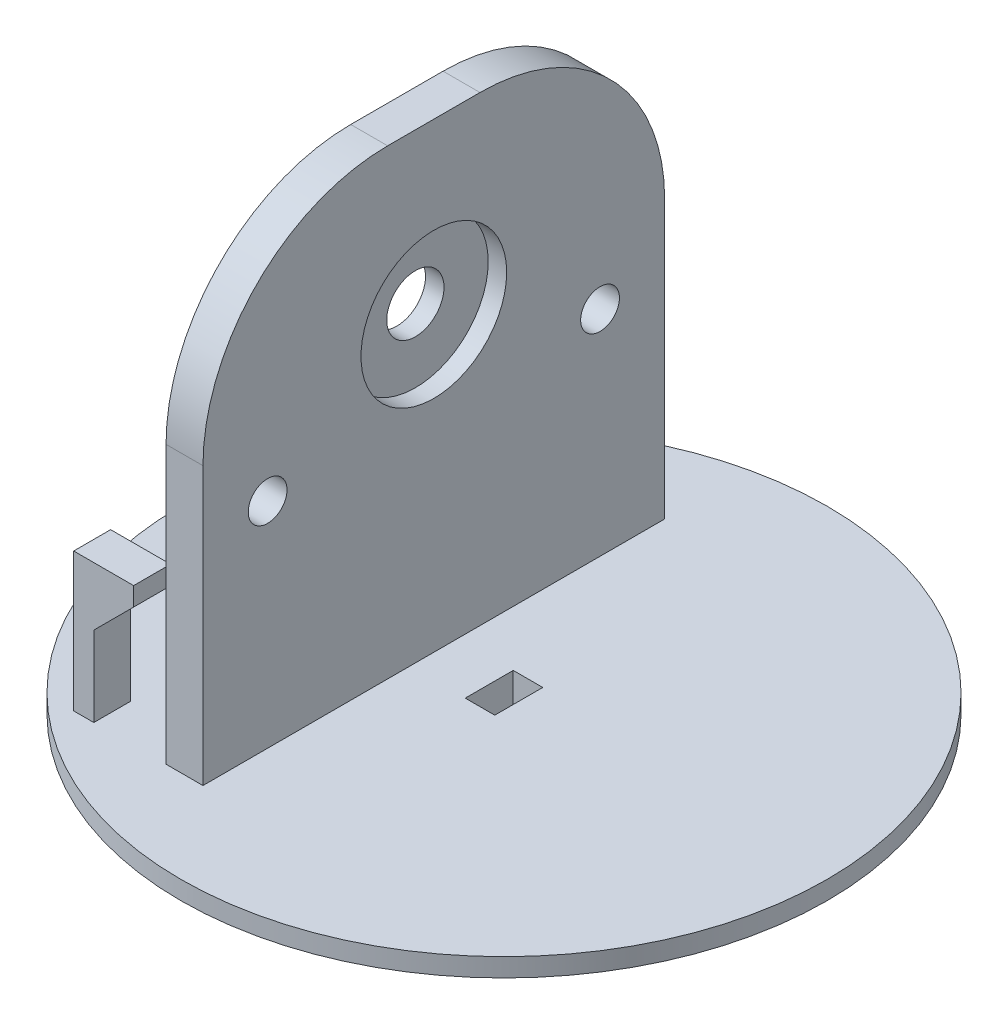
ISO-10303-21;
HEADER;
FILE_DESCRIPTION(('STEP AP214'),'2;1');
FILE_NAME('part.step','',(''),(''),'','','');
FILE_SCHEMA(('AUTOMOTIVE_DESIGN { 1 0 10303 214 1 1 1 1 }'));
ENDSEC;
DATA;
#1=APPLICATION_CONTEXT('core data for automotive mechanical design processes');
#2=APPLICATION_PROTOCOL_DEFINITION('international standard','automotive_design',2000,#1);
#3=PRODUCT_CONTEXT('',#1,'mechanical');
#4=PRODUCT('Part','Part','',(#3));
#5=PRODUCT_RELATED_PRODUCT_CATEGORY('part','',(#4));
#6=PRODUCT_DEFINITION_FORMATION('','',#4);
#7=PRODUCT_DEFINITION_CONTEXT('part definition',#1,'design');
#8=PRODUCT_DEFINITION('design','',#6,#7);
#9=PRODUCT_DEFINITION_SHAPE('','',#8);
#10=(LENGTH_UNIT() NAMED_UNIT(*) SI_UNIT(.MILLI.,.METRE.));
#11=(NAMED_UNIT(*) PLANE_ANGLE_UNIT() SI_UNIT($,.RADIAN.));
#12=(NAMED_UNIT(*) SI_UNIT($,.STERADIAN.) SOLID_ANGLE_UNIT());
#13=UNCERTAINTY_MEASURE_WITH_UNIT(LENGTH_MEASURE(1.E-05),#10,'distance_accuracy_value','');
#14=(GEOMETRIC_REPRESENTATION_CONTEXT(3) GLOBAL_UNCERTAINTY_ASSIGNED_CONTEXT((#13)) GLOBAL_UNIT_ASSIGNED_CONTEXT((#10,
#11,#12)) REPRESENTATION_CONTEXT('',''));
#15=CARTESIAN_POINT('',(0.,0.,0.));
#16=DIRECTION('',(0.,0.,1.));
#17=DIRECTION('',(1.,0.,0.));
#18=AXIS2_PLACEMENT_3D('',#15,#16,#17);
#19=CARTESIAN_POINT('',(-57.6,33.6912734460262,0.));
#20=DIRECTION('',(1.,0.,0.));
#21=DIRECTION('',(0.,0.,-1.));
#22=AXIS2_PLACEMENT_3D('',#19,#20,#21);
#23=CYLINDRICAL_SURFACE('',#22,3.1);
#24=CARTESIAN_POINT('',(-11.6,33.6912734460262,0.));
#25=DIRECTION('',(1.,0.,0.));
#26=DIRECTION('',(0.,0.,-1.));
#27=AXIS2_PLACEMENT_3D('',#24,#25,#26);
#28=CIRCLE('',#27,3.1);
#29=CARTESIAN_POINT('',(-11.6,33.6912734460262,-3.1));
#30=VERTEX_POINT('',#29);
#31=EDGE_CURVE('E173',#30,#30,#28,.T.);
#32=ORIENTED_EDGE('',*,*,#31,.F.);
#33=EDGE_LOOP('',(#32));
#34=FACE_BOUND('',#33,.T.);
#35=CARTESIAN_POINT('',(-9.6,33.6912734460262,0.));
#36=DIRECTION('',(1.,0.,0.));
#37=DIRECTION('',(0.,0.,-1.));
#38=AXIS2_PLACEMENT_3D('',#35,#36,#37);
#39=CIRCLE('',#38,3.1);
#40=CARTESIAN_POINT('',(-9.6,33.6912734460262,-3.1));
#41=VERTEX_POINT('',#40);
#42=EDGE_CURVE('E49',#41,#41,#39,.F.);
#43=ORIENTED_EDGE('',*,*,#42,.F.);
#44=EDGE_LOOP('',(#43));
#45=FACE_BOUND('',#44,.T.);
#46=ADVANCED_FACE('F45',(#34,#45),#23,.F.);
#47=CARTESIAN_POINT('',(-7.59999999999999,52.,25.));
#48=DIRECTION('',(0.,0.,-1.));
#49=DIRECTION('',(-1.,0.,0.));
#50=AXIS2_PLACEMENT_3D('',#47,#48,#49);
#51=PLANE('',#50);
#52=DIRECTION('',(1.,0.,0.));
#53=VECTOR('',#52,1.);
#54=CARTESIAN_POINT('',(-7.59999999999999,2.,25.));
#55=LINE('',#54,#53);
#56=CARTESIAN_POINT('',(-21.6,2.,25.));
#57=VERTEX_POINT('',#56);
#58=CARTESIAN_POINT('',(-19.421422774152,2.,25.));
#59=VERTEX_POINT('',#58);
#60=EDGE_CURVE('E187',#57,#59,#55,.T.);
#61=ORIENTED_EDGE('',*,*,#60,.T.);
#62=DIRECTION('',(0.,-1.,0.));
#63=VECTOR('',#62,1.);
#64=CARTESIAN_POINT('',(-19.421422774152,10.669570710931,25.));
#65=LINE('',#64,#63);
#66=CARTESIAN_POINT('',(-19.421422774152,10.669570710931,25.));
#67=VERTEX_POINT('',#66);
#68=EDGE_CURVE('E273',#67,#59,#65,.T.);
#69=ORIENTED_EDGE('',*,*,#68,.F.);
#70=DIRECTION('',(-0.707106781186548,-0.707106781186547,0.));
#71=VECTOR('',#70,1.);
#72=CARTESIAN_POINT('',(-15.1104647248126,14.9805287602704,25.));
#73=LINE('',#72,#71);
#74=CARTESIAN_POINT('',(-15.1104647248126,14.9805287602704,25.));
#75=VERTEX_POINT('',#74);
#76=EDGE_CURVE('E278',#75,#67,#73,.T.);
#77=ORIENTED_EDGE('',*,*,#76,.F.);
#78=DIRECTION('',(0.,-1.,0.));
#79=VECTOR('',#78,1.);
#80=CARTESIAN_POINT('',(-15.1104647248126,17.,25.));
#81=LINE('',#80,#79);
#82=CARTESIAN_POINT('',(-15.1104647248126,17.,25.));
#83=VERTEX_POINT('',#82);
#84=EDGE_CURVE('E271',#83,#75,#81,.T.);
#85=ORIENTED_EDGE('',*,*,#84,.F.);
#86=DIRECTION('',(1.,0.,0.));
#87=VECTOR('',#86,1.);
#88=CARTESIAN_POINT('',(-11.6,17.,25.));
#89=LINE('',#88,#87);
#90=CARTESIAN_POINT('',(-21.6,17.,25.));
#91=VERTEX_POINT('',#90);
#92=EDGE_CURVE('E289',#91,#83,#89,.T.);
#93=ORIENTED_EDGE('',*,*,#92,.F.);
#94=DIRECTION('',(0.,-1.,0.));
#95=VECTOR('',#94,1.);
#96=CARTESIAN_POINT('',(-21.6,17.,25.));
#97=LINE('',#96,#95);
#98=EDGE_CURVE('E292',#91,#57,#97,.T.);
#99=ORIENTED_EDGE('',*,*,#98,.T.);
#100=EDGE_LOOP('',(#61,#69,#77,#85,#93,#99));
#101=FACE_BOUND('',#100,.T.);
#102=ADVANCED_FACE('F338',(#101),#51,.F.);
#103=CARTESIAN_POINT('',(0.,2.,0.));
#104=DIRECTION('',(0.,1.,0.));
#105=DIRECTION('',(0.,0.,1.));
#106=AXIS2_PLACEMENT_3D('',#103,#104,#105);
#107=PLANE('',#106);
#108=DIRECTION('',(-1.,0.,0.));
#109=VECTOR('',#108,1.);
#110=CARTESIAN_POINT('',(-11.6,2.,21.));
#111=LINE('',#110,#109);
#112=CARTESIAN_POINT('',(-19.421422774152,2.,21.));
#113=VERTEX_POINT('',#112);
#114=CARTESIAN_POINT('',(-21.6,2.,21.));
#115=VERTEX_POINT('',#114);
#116=EDGE_CURVE('E283',#113,#115,#111,.T.);
#117=ORIENTED_EDGE('',*,*,#116,.F.);
#118=DIRECTION('',(0.,0.,1.));
#119=VECTOR('',#118,1.);
#120=CARTESIAN_POINT('',(-19.421422774152,2.,10.));
#121=LINE('',#120,#119);
#122=EDGE_CURVE('E275',#113,#59,#121,.T.);
#123=ORIENTED_EDGE('',*,*,#122,.T.);
#124=ORIENTED_EDGE('',*,*,#60,.F.);
#125=DIRECTION('',(0.,0.,1.));
#126=VECTOR('',#125,1.);
#127=CARTESIAN_POINT('',(-21.6,2.,25.));
#128=LINE('',#127,#126);
#129=EDGE_CURVE('E287',#115,#57,#128,.T.);
#130=ORIENTED_EDGE('',*,*,#129,.F.);
#131=EDGE_LOOP('',(#117,#123,#124,#130));
#132=FACE_BOUND('',#131,.T.);
#133=CARTESIAN_POINT('',(-11.6,2.,25.));
#134=VERTEX_POINT('',#133);
#135=CARTESIAN_POINT('',(-7.59999999999999,2.,25.));
#136=VERTEX_POINT('',#135);
#137=EDGE_CURVE('E172',#134,#136,#55,.T.);
#138=ORIENTED_EDGE('',*,*,#137,.F.);
#139=DIRECTION('',(0.,0.,1.));
#140=VECTOR('',#139,1.);
#141=CARTESIAN_POINT('',(-11.6,2.,-25.));
#142=LINE('',#141,#140);
#143=CARTESIAN_POINT('',(-11.6,2.,-25.));
#144=VERTEX_POINT('',#143);
#145=EDGE_CURVE('E161',#144,#134,#142,.T.);
#146=ORIENTED_EDGE('',*,*,#145,.F.);
#147=DIRECTION('',(-1.,0.,0.));
#148=VECTOR('',#147,1.);
#149=CARTESIAN_POINT('',(-7.6,2.,-25.));
#150=LINE('',#149,#148);
#151=CARTESIAN_POINT('',(-7.6,2.,-25.));
#152=VERTEX_POINT('',#151);
#153=EDGE_CURVE('E193',#152,#144,#150,.T.);
#154=ORIENTED_EDGE('',*,*,#153,.F.);
#155=DIRECTION('',(0.,0.,-1.));
#156=VECTOR('',#155,1.);
#157=CARTESIAN_POINT('',(-7.6,2.,-25.));
#158=LINE('',#157,#156);
#159=EDGE_CURVE('E186',#136,#152,#158,.T.);
#160=ORIENTED_EDGE('',*,*,#159,.F.);
#161=EDGE_LOOP('',(#138,#146,#154,#160));
#162=FACE_BOUND('',#161,.T.);
#163=CARTESIAN_POINT('',(0.,2.,0.));
#164=DIRECTION('',(0.,1.,0.));
#165=DIRECTION('',(0.,0.,1.));
#166=AXIS2_PLACEMENT_3D('',#163,#164,#165);
#167=CIRCLE('',#166,35.);
#168=CARTESIAN_POINT('',(0.,2.,35.));
#169=VERTEX_POINT('',#168);
#170=EDGE_CURVE('E230',#169,#169,#167,.T.);
#171=ORIENTED_EDGE('',*,*,#170,.T.);
#172=EDGE_LOOP('',(#171));
#173=FACE_BOUND('',#172,.T.);
#174=DIRECTION('',(-1.,0.,0.));
#175=VECTOR('',#174,1.);
#176=CARTESIAN_POINT('',(-1.6,2.,-2.6));
#177=LINE('',#176,#175);
#178=CARTESIAN_POINT('',(1.6,2.,-2.6));
#179=VERTEX_POINT('',#178);
#180=CARTESIAN_POINT('',(-1.6,2.,-2.6));
#181=VERTEX_POINT('',#180);
#182=EDGE_CURVE('E214',#179,#181,#177,.T.);
#183=ORIENTED_EDGE('',*,*,#182,.F.);
#184=DIRECTION('',(0.,0.,-1.));
#185=VECTOR('',#184,1.);
#186=CARTESIAN_POINT('',(1.6,2.,2.6));
#187=LINE('',#186,#185);
#188=CARTESIAN_POINT('',(1.6,2.,2.6));
#189=VERTEX_POINT('',#188);
#190=EDGE_CURVE('E212',#189,#179,#187,.T.);
#191=ORIENTED_EDGE('',*,*,#190,.F.);
#192=DIRECTION('',(1.,0.,0.));
#193=VECTOR('',#192,1.);
#194=CARTESIAN_POINT('',(-1.6,2.,2.6));
#195=LINE('',#194,#193);
#196=CARTESIAN_POINT('',(-1.6,2.,2.6));
#197=VERTEX_POINT('',#196);
#198=EDGE_CURVE('E219',#197,#189,#195,.T.);
#199=ORIENTED_EDGE('',*,*,#198,.F.);
#200=DIRECTION('',(0.,0.,1.));
#201=VECTOR('',#200,1.);
#202=CARTESIAN_POINT('',(-1.6,2.,2.6));
#203=LINE('',#202,#201);
#204=EDGE_CURVE('E216',#181,#197,#203,.T.);
#205=ORIENTED_EDGE('',*,*,#204,.F.);
#206=EDGE_LOOP('',(#183,#191,#199,#205));
#207=FACE_BOUND('',#206,.T.);
#208=ADVANCED_FACE('F183',(#132,#162,#173,#207),#107,.T.);
#209=CARTESIAN_POINT('',(-11.6,52.,-25.));
#210=DIRECTION('',(1.,0.,0.));
#211=DIRECTION('',(0.,0.,-1.));
#212=AXIS2_PLACEMENT_3D('',#209,#210,#211);
#213=PLANE('',#212);
#214=ORIENTED_EDGE('',*,*,#145,.T.);
#215=DIRECTION('',(0.,-1.,0.));
#216=VECTOR('',#215,1.);
#217=CARTESIAN_POINT('',(-11.6,52.,25.));
#218=LINE('',#217,#216);
#219=CARTESIAN_POINT('',(-11.6,32.,25.));
#220=VERTEX_POINT('',#219);
#221=EDGE_CURVE('E165',#220,#134,#218,.T.);
#222=ORIENTED_EDGE('',*,*,#221,.F.);
#223=CARTESIAN_POINT('',(-11.6,32.,5.));
#224=DIRECTION('',(1.,0.,0.));
#225=DIRECTION('',(0.,0.,-1.));
#226=AXIS2_PLACEMENT_3D('',#223,#224,#225);
#227=CIRCLE('',#226,20.);
#228=CARTESIAN_POINT('',(-11.6,52.,5.));
#229=VERTEX_POINT('',#228);
#230=EDGE_CURVE('E241',#220,#229,#227,.F.);
#231=ORIENTED_EDGE('',*,*,#230,.T.);
#232=DIRECTION('',(0.,0.,1.));
#233=VECTOR('',#232,1.);
#234=CARTESIAN_POINT('',(-11.6,52.,-25.));
#235=LINE('',#234,#233);
#236=CARTESIAN_POINT('',(-11.6,52.,-5.));
#237=VERTEX_POINT('',#236);
#238=EDGE_CURVE('E195',#237,#229,#235,.T.);
#239=ORIENTED_EDGE('',*,*,#238,.F.);
#240=CARTESIAN_POINT('',(-11.6,32.,-5.));
#241=DIRECTION('',(1.,0.,0.));
#242=DIRECTION('',(0.,0.,-1.));
#243=AXIS2_PLACEMENT_3D('',#240,#241,#242);
#244=CIRCLE('',#243,20.);
#245=CARTESIAN_POINT('',(-11.6,32.,-25.));
#246=VERTEX_POINT('',#245);
#247=EDGE_CURVE('E243',#237,#246,#244,.F.);
#248=ORIENTED_EDGE('',*,*,#247,.T.);
#249=DIRECTION('',(0.,-1.,0.));
#250=VECTOR('',#249,1.);
#251=CARTESIAN_POINT('',(-11.6,52.,-25.));
#252=LINE('',#251,#250);
#253=EDGE_CURVE('E167',#246,#144,#252,.T.);
#254=ORIENTED_EDGE('',*,*,#253,.T.);
#255=EDGE_LOOP('',(#214,#222,#231,#239,#248,#254));
#256=FACE_BOUND('',#255,.T.);
#257=ORIENTED_EDGE('',*,*,#31,.T.);
#258=EDGE_LOOP('',(#257));
#259=FACE_BOUND('',#258,.T.);
#260=CARTESIAN_POINT('',(-11.6,25.1912734460262,-18.));
#261=DIRECTION('',(1.,0.,0.));
#262=DIRECTION('',(0.,0.,-1.));
#263=AXIS2_PLACEMENT_3D('',#260,#261,#262);
#264=CIRCLE('',#263,2.1);
#265=CARTESIAN_POINT('',(-11.6,25.1912734460262,-20.1));
#266=VERTEX_POINT('',#265);
#267=EDGE_CURVE('E305',#266,#266,#264,.T.);
#268=ORIENTED_EDGE('',*,*,#267,.T.);
#269=EDGE_LOOP('',(#268));
#270=FACE_BOUND('',#269,.T.);
#271=CARTESIAN_POINT('',(-11.6,25.1912734460262,18.));
#272=DIRECTION('',(1.,0.,0.));
#273=DIRECTION('',(0.,0.,-1.));
#274=AXIS2_PLACEMENT_3D('',#271,#272,#273);
#275=CIRCLE('',#274,2.1);
#276=CARTESIAN_POINT('',(-11.6,25.1912734460262,15.9));
#277=VERTEX_POINT('',#276);
#278=EDGE_CURVE('E310',#277,#277,#275,.T.);
#279=ORIENTED_EDGE('',*,*,#278,.T.);
#280=EDGE_LOOP('',(#279));
#281=FACE_BOUND('',#280,.T.);
#282=ADVANCED_FACE('F163',(#256,#259,#270,#281),#213,.F.);
#283=CARTESIAN_POINT('',(0.,0.,0.));
#284=DIRECTION('',(0.,1.,0.));
#285=DIRECTION('',(0.,0.,1.));
#286=AXIS2_PLACEMENT_3D('',#283,#284,#285);
#287=PLANE('',#286);
#288=CARTESIAN_POINT('',(0.,0.,0.));
#289=DIRECTION('',(0.,1.,0.));
#290=DIRECTION('',(0.,0.,1.));
#291=AXIS2_PLACEMENT_3D('',#288,#289,#290);
#292=CIRCLE('',#291,10.);
#293=CARTESIAN_POINT('',(0.,0.,10.));
#294=VERTEX_POINT('',#293);
#295=EDGE_CURVE('E418',#294,#294,#292,.F.);
#296=ORIENTED_EDGE('',*,*,#295,.F.);
#297=EDGE_LOOP('',(#296));
#298=FACE_BOUND('',#297,.T.);
#299=CARTESIAN_POINT('',(0.,0.,0.));
#300=DIRECTION('',(0.,1.,0.));
#301=DIRECTION('',(0.,0.,1.));
#302=AXIS2_PLACEMENT_3D('',#299,#300,#301);
#303=CIRCLE('',#302,35.);
#304=CARTESIAN_POINT('',(0.,0.,35.));
#305=VERTEX_POINT('',#304);
#306=EDGE_CURVE('E229',#305,#305,#303,.T.);
#307=ORIENTED_EDGE('',*,*,#306,.F.);
#308=EDGE_LOOP('',(#307));
#309=FACE_BOUND('',#308,.T.);
#310=ADVANCED_FACE('F364',(#298,#309),#287,.F.);
#311=CARTESIAN_POINT('',(0.,2.,0.));
#312=DIRECTION('',(0.,-1.,0.));
#313=DIRECTION('',(0.,0.,-1.));
#314=AXIS2_PLACEMENT_3D('',#311,#312,#313);
#315=CYLINDRICAL_SURFACE('',#314,35.);
#316=ORIENTED_EDGE('',*,*,#170,.F.);
#317=EDGE_LOOP('',(#316));
#318=FACE_BOUND('',#317,.T.);
#319=ORIENTED_EDGE('',*,*,#306,.T.);
#320=EDGE_LOOP('',(#319));
#321=FACE_BOUND('',#320,.T.);
#322=ADVANCED_FACE('F383',(#318,#321),#315,.T.);
#323=CARTESIAN_POINT('',(1.6,2.,2.6));
#324=DIRECTION('',(-1.,0.,0.));
#325=DIRECTION('',(0.,0.,1.));
#326=AXIS2_PLACEMENT_3D('',#323,#324,#325);
#327=PLANE('',#326);
#328=DIRECTION('',(0.,-1.,0.));
#329=VECTOR('',#328,1.);
#330=CARTESIAN_POINT('',(1.6,2.,-2.6));
#331=LINE('',#330,#329);
#332=CARTESIAN_POINT('',(1.6,-3.,-2.6));
#333=VERTEX_POINT('',#332);
#334=EDGE_CURVE('E227',#179,#333,#331,.T.);
#335=ORIENTED_EDGE('',*,*,#334,.T.);
#336=DIRECTION('',(0.,0.,1.));
#337=VECTOR('',#336,1.);
#338=CARTESIAN_POINT('',(1.6,-3.,2.6));
#339=LINE('',#338,#337);
#340=CARTESIAN_POINT('',(1.6,-3.,2.6));
#341=VERTEX_POINT('',#340);
#342=EDGE_CURVE('E209',#333,#341,#339,.T.);
#343=ORIENTED_EDGE('',*,*,#342,.T.);
#344=DIRECTION('',(0.,-1.,0.));
#345=VECTOR('',#344,1.);
#346=CARTESIAN_POINT('',(1.6,2.,2.6));
#347=LINE('',#346,#345);
#348=EDGE_CURVE('E221',#189,#341,#347,.T.);
#349=ORIENTED_EDGE('',*,*,#348,.F.);
#350=ORIENTED_EDGE('',*,*,#190,.T.);
#351=EDGE_LOOP('',(#335,#343,#349,#350));
#352=FACE_BOUND('',#351,.T.);
#353=ADVANCED_FACE('F379',(#352),#327,.T.);
#354=CARTESIAN_POINT('',(-1.6,2.,-2.6));
#355=DIRECTION('',(0.,0.,1.));
#356=DIRECTION('',(1.,0.,0.));
#357=AXIS2_PLACEMENT_3D('',#354,#355,#356);
#358=PLANE('',#357);
#359=DIRECTION('',(0.,-1.,0.));
#360=VECTOR('',#359,1.);
#361=CARTESIAN_POINT('',(-1.6,2.,-2.6));
#362=LINE('',#361,#360);
#363=CARTESIAN_POINT('',(-1.6,-3.,-2.6));
#364=VERTEX_POINT('',#363);
#365=EDGE_CURVE('E225',#181,#364,#362,.T.);
#366=ORIENTED_EDGE('',*,*,#365,.T.);
#367=DIRECTION('',(1.,0.,0.));
#368=VECTOR('',#367,1.);
#369=CARTESIAN_POINT('',(1.6,-3.,-2.6));
#370=LINE('',#369,#368);
#371=EDGE_CURVE('E206',#364,#333,#370,.T.);
#372=ORIENTED_EDGE('',*,*,#371,.T.);
#373=ORIENTED_EDGE('',*,*,#334,.F.);
#374=ORIENTED_EDGE('',*,*,#182,.T.);
#375=EDGE_LOOP('',(#366,#372,#373,#374));
#376=FACE_BOUND('',#375,.T.);
#377=ADVANCED_FACE('F375',(#376),#358,.T.);
#378=CARTESIAN_POINT('',(-1.6,2.,2.6));
#379=DIRECTION('',(1.,0.,0.));
#380=DIRECTION('',(0.,0.,-1.));
#381=AXIS2_PLACEMENT_3D('',#378,#379,#380);
#382=PLANE('',#381);
#383=DIRECTION('',(0.,-1.,0.));
#384=VECTOR('',#383,1.);
#385=CARTESIAN_POINT('',(-1.6,2.,2.6));
#386=LINE('',#385,#384);
#387=CARTESIAN_POINT('',(-1.6,-3.,2.6));
#388=VERTEX_POINT('',#387);
#389=EDGE_CURVE('E223',#197,#388,#386,.T.);
#390=ORIENTED_EDGE('',*,*,#389,.T.);
#391=DIRECTION('',(0.,0.,-1.));
#392=VECTOR('',#391,1.);
#393=CARTESIAN_POINT('',(-1.6,-3.,-2.6));
#394=LINE('',#393,#392);
#395=EDGE_CURVE('E203',#388,#364,#394,.T.);
#396=ORIENTED_EDGE('',*,*,#395,.T.);
#397=ORIENTED_EDGE('',*,*,#365,.F.);
#398=ORIENTED_EDGE('',*,*,#204,.T.);
#399=EDGE_LOOP('',(#390,#396,#397,#398));
#400=FACE_BOUND('',#399,.T.);
#401=ADVANCED_FACE('F371',(#400),#382,.T.);
#402=CARTESIAN_POINT('',(-1.6,2.,2.6));
#403=DIRECTION('',(0.,0.,-1.));
#404=DIRECTION('',(-1.,0.,0.));
#405=AXIS2_PLACEMENT_3D('',#402,#403,#404);
#406=PLANE('',#405);
#407=ORIENTED_EDGE('',*,*,#348,.T.);
#408=DIRECTION('',(-1.,0.,0.));
#409=VECTOR('',#408,1.);
#410=CARTESIAN_POINT('',(-1.6,-3.,2.6));
#411=LINE('',#410,#409);
#412=EDGE_CURVE('E179',#341,#388,#411,.T.);
#413=ORIENTED_EDGE('',*,*,#412,.T.);
#414=ORIENTED_EDGE('',*,*,#389,.F.);
#415=ORIENTED_EDGE('',*,*,#198,.T.);
#416=EDGE_LOOP('',(#407,#413,#414,#415));
#417=FACE_BOUND('',#416,.T.);
#418=ADVANCED_FACE('F367',(#417),#406,.T.);
#419=CARTESIAN_POINT('',(0.,-3.,0.));
#420=DIRECTION('',(0.,1.,0.));
#421=DIRECTION('',(0.,0.,1.));
#422=AXIS2_PLACEMENT_3D('',#419,#420,#421);
#423=PLANE('',#422);
#424=ORIENTED_EDGE('',*,*,#412,.F.);
#425=ORIENTED_EDGE('',*,*,#342,.F.);
#426=ORIENTED_EDGE('',*,*,#371,.F.);
#427=ORIENTED_EDGE('',*,*,#395,.F.);
#428=EDGE_LOOP('',(#424,#425,#426,#427));
#429=FACE_BOUND('',#428,.T.);
#430=CARTESIAN_POINT('',(0.,-3.,0.));
#431=DIRECTION('',(0.,-1.,0.));
#432=DIRECTION('',(0.,0.,-1.));
#433=AXIS2_PLACEMENT_3D('',#430,#431,#432);
#434=CIRCLE('',#433,10.);
#435=CARTESIAN_POINT('',(0.,-3.,-10.));
#436=VERTEX_POINT('',#435);
#437=EDGE_CURVE('E415',#436,#436,#434,.T.);
#438=ORIENTED_EDGE('',*,*,#437,.T.);
#439=EDGE_LOOP('',(#438));
#440=FACE_BOUND('',#439,.T.);
#441=ADVANCED_FACE('F361',(#429,#440),#423,.F.);
#442=ORIENTED_EDGE('',*,*,#221,.T.);
#443=ORIENTED_EDGE('',*,*,#137,.T.);
#444=DIRECTION('',(0.,-1.,0.));
#445=VECTOR('',#444,1.);
#446=CARTESIAN_POINT('',(-7.59999999999999,52.,25.));
#447=LINE('',#446,#445);
#448=CARTESIAN_POINT('',(-7.59999999999999,32.,25.));
#449=VERTEX_POINT('',#448);
#450=EDGE_CURVE('E180',#449,#136,#447,.T.);
#451=ORIENTED_EDGE('',*,*,#450,.F.);
#452=DIRECTION('',(1.,0.,0.));
#453=VECTOR('',#452,1.);
#454=CARTESIAN_POINT('',(-7.59999999999999,32.,25.));
#455=LINE('',#454,#453);
#456=EDGE_CURVE('E178',#449,#220,#455,.F.);
#457=ORIENTED_EDGE('',*,*,#456,.T.);
#458=EDGE_LOOP('',(#442,#443,#451,#457));
#459=FACE_BOUND('',#458,.T.);
#460=ADVANCED_FACE('F176',(#459),#51,.F.);
#461=CARTESIAN_POINT('',(-7.6,52.,-25.));
#462=DIRECTION('',(-1.,0.,0.));
#463=DIRECTION('',(0.,0.,1.));
#464=AXIS2_PLACEMENT_3D('',#461,#462,#463);
#465=PLANE('',#464);
#466=CARTESIAN_POINT('',(-7.6,33.6912734460262,0.));
#467=DIRECTION('',(1.,0.,0.));
#468=DIRECTION('',(0.,0.,-1.));
#469=AXIS2_PLACEMENT_3D('',#466,#467,#468);
#470=CIRCLE('',#469,7.88910984210623);
#471=CARTESIAN_POINT('',(-7.6,33.6912734460262,-7.88910984210623));
#472=VERTEX_POINT('',#471);
#473=EDGE_CURVE('E417',#472,#472,#470,.T.);
#474=ORIENTED_EDGE('',*,*,#473,.F.);
#475=EDGE_LOOP('',(#474));
#476=FACE_BOUND('',#475,.T.);
#477=CARTESIAN_POINT('',(-7.59999999999999,25.1912734460262,18.));
#478=DIRECTION('',(1.,0.,0.));
#479=DIRECTION('',(0.,0.,-1.));
#480=AXIS2_PLACEMENT_3D('',#477,#478,#479);
#481=CIRCLE('',#480,2.1);
#482=CARTESIAN_POINT('',(-7.59999999999999,25.1912734460262,15.9));
#483=VERTEX_POINT('',#482);
#484=EDGE_CURVE('E302',#483,#483,#481,.T.);
#485=ORIENTED_EDGE('',*,*,#484,.F.);
#486=EDGE_LOOP('',(#485));
#487=FACE_BOUND('',#486,.T.);
#488=CARTESIAN_POINT('',(-7.6,25.1912734460262,-18.));
#489=DIRECTION('',(1.,0.,0.));
#490=DIRECTION('',(0.,0.,1.));
#491=AXIS2_PLACEMENT_3D('',#488,#489,#490);
#492=CIRCLE('',#491,2.1);
#493=CARTESIAN_POINT('',(-7.6,25.1912734460262,-15.9));
#494=VERTEX_POINT('',#493);
#495=EDGE_CURVE('E301',#494,#494,#492,.T.);
#496=ORIENTED_EDGE('',*,*,#495,.F.);
#497=EDGE_LOOP('',(#496));
#498=FACE_BOUND('',#497,.T.);
#499=DIRECTION('',(0.,-1.,0.));
#500=VECTOR('',#499,1.);
#501=CARTESIAN_POINT('',(-7.6,52.,-25.));
#502=LINE('',#501,#500);
#503=CARTESIAN_POINT('',(-7.6,32.,-25.));
#504=VERTEX_POINT('',#503);
#505=EDGE_CURVE('E197',#504,#152,#502,.T.);
#506=ORIENTED_EDGE('',*,*,#505,.F.);
#507=CARTESIAN_POINT('',(-7.6,32.,-5.));
#508=DIRECTION('',(-1.,0.,0.));
#509=DIRECTION('',(0.,0.,1.));
#510=AXIS2_PLACEMENT_3D('',#507,#508,#509);
#511=CIRCLE('',#510,20.);
#512=CARTESIAN_POINT('',(-7.6,52.,-5.));
#513=VERTEX_POINT('',#512);
#514=EDGE_CURVE('E247',#504,#513,#511,.F.);
#515=ORIENTED_EDGE('',*,*,#514,.T.);
#516=DIRECTION('',(0.,0.,-1.));
#517=VECTOR('',#516,1.);
#518=CARTESIAN_POINT('',(-7.6,52.,-25.));
#519=LINE('',#518,#517);
#520=CARTESIAN_POINT('',(-7.6,52.,5.));
#521=VERTEX_POINT('',#520);
#522=EDGE_CURVE('E198',#521,#513,#519,.T.);
#523=ORIENTED_EDGE('',*,*,#522,.F.);
#524=CARTESIAN_POINT('',(-7.6,32.,5.));
#525=DIRECTION('',(-1.,0.,0.));
#526=DIRECTION('',(0.,0.,1.));
#527=AXIS2_PLACEMENT_3D('',#524,#525,#526);
#528=CIRCLE('',#527,20.);
#529=EDGE_CURVE('E61',#521,#449,#528,.F.);
#530=ORIENTED_EDGE('',*,*,#529,.T.);
#531=ORIENTED_EDGE('',*,*,#450,.T.);
#532=ORIENTED_EDGE('',*,*,#159,.T.);
#533=EDGE_LOOP('',(#506,#515,#523,#530,#531,#532));
#534=FACE_BOUND('',#533,.T.);
#535=ADVANCED_FACE('F326',(#476,#487,#498,#534),#465,.F.);
#536=CARTESIAN_POINT('',(-7.6,52.,-25.));
#537=DIRECTION('',(0.,0.,1.));
#538=DIRECTION('',(1.,0.,0.));
#539=AXIS2_PLACEMENT_3D('',#536,#537,#538);
#540=PLANE('',#539);
#541=ORIENTED_EDGE('',*,*,#253,.F.);
#542=DIRECTION('',(-1.,0.,0.));
#543=VECTOR('',#542,1.);
#544=CARTESIAN_POINT('',(-7.6,32.,-25.));
#545=LINE('',#544,#543);
#546=EDGE_CURVE('E69',#246,#504,#545,.F.);
#547=ORIENTED_EDGE('',*,*,#546,.T.);
#548=ORIENTED_EDGE('',*,*,#505,.T.);
#549=ORIENTED_EDGE('',*,*,#153,.T.);
#550=EDGE_LOOP('',(#541,#547,#548,#549));
#551=FACE_BOUND('',#550,.T.);
#552=ADVANCED_FACE('F325',(#551),#540,.F.);
#553=CARTESIAN_POINT('',(0.,52.,0.));
#554=DIRECTION('',(0.,-1.,0.));
#555=DIRECTION('',(0.,0.,-1.));
#556=AXIS2_PLACEMENT_3D('',#553,#554,#555);
#557=PLANE('',#556);
#558=ORIENTED_EDGE('',*,*,#522,.T.);
#559=DIRECTION('',(-1.,0.,0.));
#560=VECTOR('',#559,1.);
#561=CARTESIAN_POINT('',(0.,52.,-5.));
#562=LINE('',#561,#560);
#563=EDGE_CURVE('E238',#513,#237,#562,.T.);
#564=ORIENTED_EDGE('',*,*,#563,.T.);
#565=ORIENTED_EDGE('',*,*,#238,.T.);
#566=DIRECTION('',(1.,0.,0.));
#567=VECTOR('',#566,1.);
#568=CARTESIAN_POINT('',(0.,52.,5.));
#569=LINE('',#568,#567);
#570=EDGE_CURVE('E233',#229,#521,#569,.T.);
#571=ORIENTED_EDGE('',*,*,#570,.T.);
#572=EDGE_LOOP('',(#558,#564,#565,#571));
#573=FACE_BOUND('',#572,.T.);
#574=ADVANCED_FACE('F319',(#573),#557,.F.);
#575=CARTESIAN_POINT('',(-57.6,25.1912734460262,-18.));
#576=DIRECTION('',(1.,0.,0.));
#577=DIRECTION('',(0.,0.,-1.));
#578=AXIS2_PLACEMENT_3D('',#575,#576,#577);
#579=CYLINDRICAL_SURFACE('',#578,2.1);
#580=ORIENTED_EDGE('',*,*,#495,.T.);
#581=EDGE_LOOP('',(#580));
#582=FACE_BOUND('',#581,.T.);
#583=ORIENTED_EDGE('',*,*,#267,.F.);
#584=EDGE_LOOP('',(#583));
#585=FACE_BOUND('',#584,.T.);
#586=ADVANCED_FACE('F352',(#582,#585),#579,.F.);
#587=CARTESIAN_POINT('',(-57.6,25.1912734460262,18.));
#588=DIRECTION('',(1.,0.,0.));
#589=DIRECTION('',(0.,0.,-1.));
#590=AXIS2_PLACEMENT_3D('',#587,#588,#589);
#591=CYLINDRICAL_SURFACE('',#590,2.1);
#592=ORIENTED_EDGE('',*,*,#484,.T.);
#593=EDGE_LOOP('',(#592));
#594=FACE_BOUND('',#593,.T.);
#595=ORIENTED_EDGE('',*,*,#278,.F.);
#596=EDGE_LOOP('',(#595));
#597=FACE_BOUND('',#596,.T.);
#598=ADVANCED_FACE('F336',(#594,#597),#591,.F.);
#599=CARTESIAN_POINT('',(0.,32.,-5.));
#600=DIRECTION('',(-1.,0.,0.));
#601=DIRECTION('',(0.,0.,1.));
#602=AXIS2_PLACEMENT_3D('',#599,#600,#601);
#603=CYLINDRICAL_SURFACE('',#602,20.);
#604=ORIENTED_EDGE('',*,*,#514,.F.);
#605=ORIENTED_EDGE('',*,*,#546,.F.);
#606=ORIENTED_EDGE('',*,*,#247,.F.);
#607=ORIENTED_EDGE('',*,*,#563,.F.);
#608=EDGE_LOOP('',(#604,#605,#606,#607));
#609=FACE_BOUND('',#608,.T.);
#610=ADVANCED_FACE('F324',(#609),#603,.T.);
#611=CARTESIAN_POINT('',(0.,32.,5.));
#612=DIRECTION('',(1.,0.,0.));
#613=DIRECTION('',(0.,0.,-1.));
#614=AXIS2_PLACEMENT_3D('',#611,#612,#613);
#615=CYLINDRICAL_SURFACE('',#614,20.);
#616=ORIENTED_EDGE('',*,*,#230,.F.);
#617=ORIENTED_EDGE('',*,*,#456,.F.);
#618=ORIENTED_EDGE('',*,*,#529,.F.);
#619=ORIENTED_EDGE('',*,*,#570,.F.);
#620=EDGE_LOOP('',(#616,#617,#618,#619));
#621=FACE_BOUND('',#620,.T.);
#622=ADVANCED_FACE('F47',(#621),#615,.T.);
#623=CARTESIAN_POINT('',(-11.6,17.,21.));
#624=DIRECTION('',(0.,0.,1.));
#625=DIRECTION('',(1.,0.,0.));
#626=AXIS2_PLACEMENT_3D('',#623,#624,#625);
#627=PLANE('',#626);
#628=DIRECTION('',(-0.707106781186548,-0.707106781186547,0.));
#629=VECTOR('',#628,1.);
#630=CARTESIAN_POINT('',(-12.3454967425415,17.7454967425415,21.));
#631=LINE('',#630,#629);
#632=CARTESIAN_POINT('',(-15.1104647248126,14.9805287602704,21.));
#633=VERTEX_POINT('',#632);
#634=CARTESIAN_POINT('',(-19.421422774152,10.669570710931,21.));
#635=VERTEX_POINT('',#634);
#636=EDGE_CURVE('E54',#633,#635,#631,.T.);
#637=ORIENTED_EDGE('',*,*,#636,.T.);
#638=DIRECTION('',(0.,-1.,0.));
#639=VECTOR('',#638,1.);
#640=CARTESIAN_POINT('',(-19.421422774152,17.,21.));
#641=LINE('',#640,#639);
#642=EDGE_CURVE('E13',#635,#113,#641,.T.);
#643=ORIENTED_EDGE('',*,*,#642,.T.);
#644=ORIENTED_EDGE('',*,*,#116,.T.);
#645=DIRECTION('',(0.,-1.,0.));
#646=VECTOR('',#645,1.);
#647=CARTESIAN_POINT('',(-21.6,17.,21.));
#648=LINE('',#647,#646);
#649=CARTESIAN_POINT('',(-21.6,17.,21.));
#650=VERTEX_POINT('',#649);
#651=EDGE_CURVE('E298',#650,#115,#648,.T.);
#652=ORIENTED_EDGE('',*,*,#651,.F.);
#653=DIRECTION('',(-1.,0.,0.));
#654=VECTOR('',#653,1.);
#655=CARTESIAN_POINT('',(-11.6,17.,21.));
#656=LINE('',#655,#654);
#657=CARTESIAN_POINT('',(-15.1104647248126,17.,21.));
#658=VERTEX_POINT('',#657);
#659=EDGE_CURVE('E284',#658,#650,#656,.T.);
#660=ORIENTED_EDGE('',*,*,#659,.F.);
#661=DIRECTION('',(0.,-1.,0.));
#662=VECTOR('',#661,1.);
#663=CARTESIAN_POINT('',(-15.1104647248126,17.,21.));
#664=LINE('',#663,#662);
#665=EDGE_CURVE('E258',#658,#633,#664,.T.);
#666=ORIENTED_EDGE('',*,*,#665,.T.);
#667=EDGE_LOOP('',(#637,#643,#644,#652,#660,#666));
#668=FACE_BOUND('',#667,.T.);
#669=ADVANCED_FACE('F255',(#668),#627,.F.);
#670=CARTESIAN_POINT('',(-21.6,17.,25.));
#671=DIRECTION('',(1.,0.,0.));
#672=DIRECTION('',(0.,0.,-1.));
#673=AXIS2_PLACEMENT_3D('',#670,#671,#672);
#674=PLANE('',#673);
#675=ORIENTED_EDGE('',*,*,#129,.T.);
#676=ORIENTED_EDGE('',*,*,#98,.F.);
#677=DIRECTION('',(0.,0.,1.));
#678=VECTOR('',#677,1.);
#679=CARTESIAN_POINT('',(-21.6,17.,25.));
#680=LINE('',#679,#678);
#681=EDGE_CURVE('E286',#650,#91,#680,.T.);
#682=ORIENTED_EDGE('',*,*,#681,.F.);
#683=ORIENTED_EDGE('',*,*,#651,.T.);
#684=EDGE_LOOP('',(#675,#676,#682,#683));
#685=FACE_BOUND('',#684,.T.);
#686=ADVANCED_FACE('F334',(#685),#674,.F.);
#687=CARTESIAN_POINT('',(0.,17.,0.));
#688=DIRECTION('',(0.,1.,0.));
#689=DIRECTION('',(0.,0.,1.));
#690=AXIS2_PLACEMENT_3D('',#687,#688,#689);
#691=PLANE('',#690);
#692=DIRECTION('',(0.,0.,1.));
#693=VECTOR('',#692,1.);
#694=CARTESIAN_POINT('',(-15.1104647248126,17.,0.));
#695=LINE('',#694,#693);
#696=EDGE_CURVE('E250',#658,#83,#695,.T.);
#697=ORIENTED_EDGE('',*,*,#696,.F.);
#698=ORIENTED_EDGE('',*,*,#659,.T.);
#699=ORIENTED_EDGE('',*,*,#681,.T.);
#700=ORIENTED_EDGE('',*,*,#92,.T.);
#701=EDGE_LOOP('',(#697,#698,#699,#700));
#702=FACE_BOUND('',#701,.T.);
#703=ADVANCED_FACE('F439',(#702),#691,.T.);
#704=CARTESIAN_POINT('',(-19.421422774152,10.669570710931,10.));
#705=DIRECTION('',(-1.,0.,0.));
#706=DIRECTION('',(0.,0.,1.));
#707=AXIS2_PLACEMENT_3D('',#704,#705,#706);
#708=PLANE('',#707);
#709=DIRECTION('',(0.,0.,1.));
#710=VECTOR('',#709,1.);
#711=CARTESIAN_POINT('',(-19.421422774152,10.669570710931,10.));
#712=LINE('',#711,#710);
#713=EDGE_CURVE('E266',#635,#67,#712,.T.);
#714=ORIENTED_EDGE('',*,*,#713,.T.);
#715=ORIENTED_EDGE('',*,*,#68,.T.);
#716=ORIENTED_EDGE('',*,*,#122,.F.);
#717=ORIENTED_EDGE('',*,*,#642,.F.);
#718=EDGE_LOOP('',(#714,#715,#716,#717));
#719=FACE_BOUND('',#718,.T.);
#720=ADVANCED_FACE('F432',(#719),#708,.F.);
#721=CARTESIAN_POINT('',(-15.1104647248126,14.9805287602704,10.));
#722=DIRECTION('',(-0.707106781186547,0.707106781186548,0.));
#723=DIRECTION('',(-0.707106781186548,-0.707106781186547,0.));
#724=AXIS2_PLACEMENT_3D('',#721,#722,#723);
#725=PLANE('',#724);
#726=DIRECTION('',(0.,0.,1.));
#727=VECTOR('',#726,1.);
#728=CARTESIAN_POINT('',(-15.1104647248126,14.9805287602704,10.));
#729=LINE('',#728,#727);
#730=EDGE_CURVE('E264',#633,#75,#729,.T.);
#731=ORIENTED_EDGE('',*,*,#730,.T.);
#732=ORIENTED_EDGE('',*,*,#76,.T.);
#733=ORIENTED_EDGE('',*,*,#713,.F.);
#734=ORIENTED_EDGE('',*,*,#636,.F.);
#735=EDGE_LOOP('',(#731,#732,#733,#734));
#736=FACE_BOUND('',#735,.T.);
#737=ADVANCED_FACE('F262',(#736),#725,.F.);
#738=CARTESIAN_POINT('',(-15.1104647248126,17.,10.));
#739=DIRECTION('',(-1.,0.,0.));
#740=DIRECTION('',(0.,-1.,0.));
#741=AXIS2_PLACEMENT_3D('',#738,#739,#740);
#742=PLANE('',#741);
#743=ORIENTED_EDGE('',*,*,#696,.T.);
#744=ORIENTED_EDGE('',*,*,#84,.T.);
#745=ORIENTED_EDGE('',*,*,#730,.F.);
#746=ORIENTED_EDGE('',*,*,#665,.F.);
#747=EDGE_LOOP('',(#743,#744,#745,#746));
#748=FACE_BOUND('',#747,.T.);
#749=ADVANCED_FACE('F268',(#748),#742,.F.);
#750=CARTESIAN_POINT('',(-9.6,33.6912734460262,0.));
#751=DIRECTION('',(1.,0.,0.));
#752=DIRECTION('',(0.,0.,-1.));
#753=AXIS2_PLACEMENT_3D('',#750,#751,#752);
#754=PLANE('',#753);
#755=CARTESIAN_POINT('',(-9.6,33.6912734460262,0.));
#756=DIRECTION('',(1.,0.,0.));
#757=DIRECTION('',(0.,0.,-1.));
#758=AXIS2_PLACEMENT_3D('',#755,#756,#757);
#759=CIRCLE('',#758,7.88910984210623);
#760=CARTESIAN_POINT('',(-9.6,33.6912734460262,-7.88910984210623));
#761=VERTEX_POINT('',#760);
#762=EDGE_CURVE('E421',#761,#761,#759,.T.);
#763=ORIENTED_EDGE('',*,*,#762,.T.);
#764=EDGE_LOOP('',(#763));
#765=FACE_BOUND('',#764,.T.);
#766=ORIENTED_EDGE('',*,*,#42,.T.);
#767=EDGE_LOOP('',(#766));
#768=FACE_BOUND('',#767,.T.);
#769=ADVANCED_FACE('F559',(#765,#768),#754,.T.);
#770=CARTESIAN_POINT('',(-9.6,33.6912734460262,0.));
#771=DIRECTION('',(1.,0.,0.));
#772=DIRECTION('',(0.,0.,-1.));
#773=AXIS2_PLACEMENT_3D('',#770,#771,#772);
#774=CYLINDRICAL_SURFACE('',#773,7.88910984210623);
#775=ORIENTED_EDGE('',*,*,#762,.F.);
#776=EDGE_LOOP('',(#775));
#777=FACE_BOUND('',#776,.T.);
#778=ORIENTED_EDGE('',*,*,#473,.T.);
#779=EDGE_LOOP('',(#778));
#780=FACE_BOUND('',#779,.T.);
#781=ADVANCED_FACE('F539',(#777,#780),#774,.F.);
#782=CARTESIAN_POINT('',(0.,28.2842712474619,0.));
#783=DIRECTION('',(0.,-1.,0.));
#784=DIRECTION('',(0.,0.,-1.));
#785=AXIS2_PLACEMENT_3D('',#782,#783,#784);
#786=CYLINDRICAL_SURFACE('',#785,10.);
#787=ORIENTED_EDGE('',*,*,#437,.F.);
#788=EDGE_LOOP('',(#787));
#789=FACE_BOUND('',#788,.T.);
#790=ORIENTED_EDGE('',*,*,#295,.T.);
#791=EDGE_LOOP('',(#790));
#792=FACE_BOUND('',#791,.T.);
#793=ADVANCED_FACE('F550',(#789,#792),#786,.T.);
#794=CLOSED_SHELL('',(#46,#102,#208,#282,#310,#322,#353,#377,#401,#418,#441,#460,#535,#552,#574,
#586,#598,#610,#622,#669,#686,#703,#720,#737,#749,#769,#781,#793));
#795=MANIFOLD_SOLID_BREP('B2',#794);
#796=ADVANCED_BREP_SHAPE_REPRESENTATION('',(#18,#795),#14);
#797=SHAPE_DEFINITION_REPRESENTATION(#9,#796);
ENDSEC;
END-ISO-10303-21;
